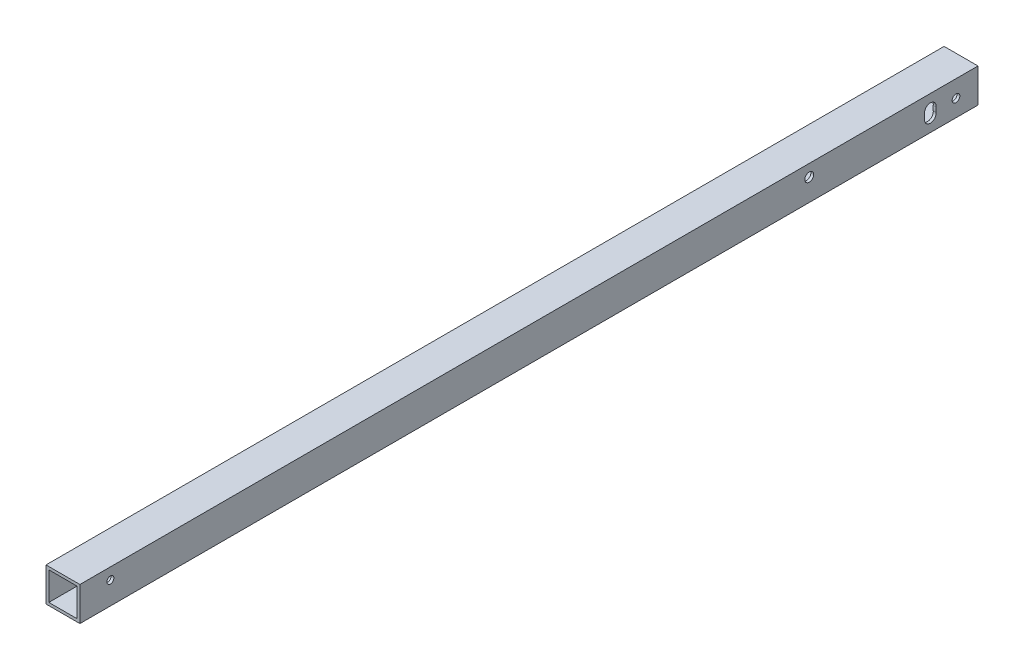
ISO-10303-21;
HEADER;
FILE_DESCRIPTION(('STEP AP214'),'2;1');
FILE_NAME('part.step','',(''),(''),'','','');
FILE_SCHEMA(('AUTOMOTIVE_DESIGN { 1 0 10303 214 1 1 1 1 }'));
ENDSEC;
DATA;
#1=APPLICATION_CONTEXT('core data for automotive mechanical design processes');
#2=APPLICATION_PROTOCOL_DEFINITION('international standard','automotive_design',2000,#1);
#3=PRODUCT_CONTEXT('',#1,'mechanical');
#4=PRODUCT('Part','Part','',(#3));
#5=PRODUCT_RELATED_PRODUCT_CATEGORY('part','',(#4));
#6=PRODUCT_DEFINITION_FORMATION('','',#4);
#7=PRODUCT_DEFINITION_CONTEXT('part definition',#1,'design');
#8=PRODUCT_DEFINITION('design','',#6,#7);
#9=PRODUCT_DEFINITION_SHAPE('','',#8);
#10=(LENGTH_UNIT() NAMED_UNIT(*) SI_UNIT(.MILLI.,.METRE.));
#11=(NAMED_UNIT(*) PLANE_ANGLE_UNIT() SI_UNIT($,.RADIAN.));
#12=(NAMED_UNIT(*) SI_UNIT($,.STERADIAN.) SOLID_ANGLE_UNIT());
#13=UNCERTAINTY_MEASURE_WITH_UNIT(LENGTH_MEASURE(1.E-05),#10,'distance_accuracy_value','');
#14=(GEOMETRIC_REPRESENTATION_CONTEXT(3) GLOBAL_UNCERTAINTY_ASSIGNED_CONTEXT((#13)) GLOBAL_UNIT_ASSIGNED_CONTEXT((#10,
#11,#12)) REPRESENTATION_CONTEXT('',''));
#15=CARTESIAN_POINT('',(0.,0.,0.));
#16=DIRECTION('',(0.,0.,1.));
#17=DIRECTION('',(1.,0.,0.));
#18=AXIS2_PLACEMENT_3D('',#15,#16,#17);
#19=CARTESIAN_POINT('',(-514.70930609531,11.2268,29.9795189389552));
#20=DIRECTION('',(1.,0.,0.));
#21=DIRECTION('',(0.,0.,-1.));
#22=AXIS2_PLACEMENT_3D('',#19,#20,#21);
#23=CYLINDRICAL_SURFACE('',#22,3.2512);
#24=DIRECTION('',(1.,0.,0.));
#25=VECTOR('',#24,1.);
#26=CARTESIAN_POINT('',(-514.70930609531,11.6073682278985,33.2083684653212));
#27=LINE('',#26,#25);
#28=CARTESIAN_POINT('',(7.93750000000004,11.6073682278985,33.2083684653212));
#29=VERTEX_POINT('',#28);
#30=CARTESIAN_POINT('',(9.525,11.6073682278985,33.2083684653212));
#31=VERTEX_POINT('',#30);
#32=EDGE_CURVE('E273',#29,#31,#27,.T.);
#33=ORIENTED_EDGE('',*,*,#32,.F.);
#34=CARTESIAN_POINT('',(7.93750000000004,11.2268,29.9795189389552));
#35=DIRECTION('',(1.,0.,0.));
#36=DIRECTION('',(0.,0.,-1.));
#37=AXIS2_PLACEMENT_3D('',#34,#35,#36);
#38=CIRCLE('',#37,3.2512);
#39=CARTESIAN_POINT('',(7.93750000000004,10.8462317721015,26.7506694125892));
#40=VERTEX_POINT('',#39);
#41=EDGE_CURVE('E218',#29,#40,#38,.F.);
#42=ORIENTED_EDGE('',*,*,#41,.T.);
#43=DIRECTION('',(1.,0.,0.));
#44=VECTOR('',#43,1.);
#45=CARTESIAN_POINT('',(-514.70930609531,10.8462317721015,26.7506694125892));
#46=LINE('',#45,#44);
#47=CARTESIAN_POINT('',(9.52500000000001,10.8462317721015,26.7506694125892));
#48=VERTEX_POINT('',#47);
#49=EDGE_CURVE('E260',#40,#48,#46,.T.);
#50=ORIENTED_EDGE('',*,*,#49,.T.);
#51=CARTESIAN_POINT('',(9.525,11.2268,29.9795189389552));
#52=DIRECTION('',(1.,0.,0.));
#53=DIRECTION('',(0.,0.,-1.));
#54=AXIS2_PLACEMENT_3D('',#51,#52,#53);
#55=CIRCLE('',#54,3.2512);
#56=EDGE_CURVE('E251',#48,#31,#55,.T.);
#57=ORIENTED_EDGE('',*,*,#56,.T.);
#58=EDGE_LOOP('',(#33,#42,#50,#57));
#59=FACE_BOUND('',#58,.T.);
#60=ADVANCED_FACE('F36',(#59),#23,.F.);
#61=CARTESIAN_POINT('',(-514.70930609531,9.525,15.5409617469566));
#62=DIRECTION('',(1.,0.,0.));
#63=DIRECTION('',(0.,0.,-1.));
#64=AXIS2_PLACEMENT_3D('',#61,#62,#63);
#65=CYLINDRICAL_SURFACE('',#64,17.7897025716755);
#66=DIRECTION('',(1.,0.,0.));
#67=VECTOR('',#66,1.);
#68=CARTESIAN_POINT('',(-514.70930609531,7.44263177210153,33.2083684653212));
#69=LINE('',#68,#67);
#70=CARTESIAN_POINT('',(7.93750000000004,7.44263177210153,33.2083684653212));
#71=VERTEX_POINT('',#70);
#72=CARTESIAN_POINT('',(9.525,7.44263177210153,33.2083684653212));
#73=VERTEX_POINT('',#72);
#74=EDGE_CURVE('E269',#71,#73,#69,.T.);
#75=ORIENTED_EDGE('',*,*,#74,.F.);
#76=CARTESIAN_POINT('',(7.93750000000004,9.525,15.5409617469566));
#77=DIRECTION('',(1.,0.,0.));
#78=DIRECTION('',(0.,0.,-1.));
#79=AXIS2_PLACEMENT_3D('',#76,#77,#78);
#80=CIRCLE('',#79,17.7897025716755);
#81=EDGE_CURVE('E215',#71,#29,#80,.F.);
#82=ORIENTED_EDGE('',*,*,#81,.T.);
#83=ORIENTED_EDGE('',*,*,#32,.T.);
#84=CARTESIAN_POINT('',(9.525,9.525,15.5409617469566));
#85=DIRECTION('',(1.,0.,0.));
#86=DIRECTION('',(0.,0.,-1.));
#87=AXIS2_PLACEMENT_3D('',#84,#85,#86);
#88=CIRCLE('',#87,17.7897025716755);
#89=EDGE_CURVE('E254',#31,#73,#88,.T.);
#90=ORIENTED_EDGE('',*,*,#89,.T.);
#91=EDGE_LOOP('',(#75,#82,#83,#90));
#92=FACE_BOUND('',#91,.T.);
#93=ADVANCED_FACE('F318',(#92),#65,.F.);
#94=CARTESIAN_POINT('',(-514.70930609531,7.8232,29.9795189389552));
#95=DIRECTION('',(1.,0.,0.));
#96=DIRECTION('',(0.,0.,-1.));
#97=AXIS2_PLACEMENT_3D('',#94,#95,#96);
#98=CYLINDRICAL_SURFACE('',#97,3.2512);
#99=DIRECTION('',(1.,0.,0.));
#100=VECTOR('',#99,1.);
#101=CARTESIAN_POINT('',(-514.70930609531,8.20376822789848,26.7506694125892));
#102=LINE('',#101,#100);
#103=CARTESIAN_POINT('',(7.93750000000004,8.20376822789848,26.7506694125892));
#104=VERTEX_POINT('',#103);
#105=CARTESIAN_POINT('',(9.525,8.20376822789848,26.7506694125892));
#106=VERTEX_POINT('',#105);
#107=EDGE_CURVE('E265',#104,#106,#102,.T.);
#108=ORIENTED_EDGE('',*,*,#107,.F.);
#109=CARTESIAN_POINT('',(7.93750000000004,7.8232,29.9795189389552));
#110=DIRECTION('',(1.,0.,0.));
#111=DIRECTION('',(0.,0.,-1.));
#112=AXIS2_PLACEMENT_3D('',#109,#110,#111);
#113=CIRCLE('',#112,3.2512);
#114=EDGE_CURVE('E212',#104,#71,#113,.F.);
#115=ORIENTED_EDGE('',*,*,#114,.T.);
#116=ORIENTED_EDGE('',*,*,#74,.T.);
#117=CARTESIAN_POINT('',(9.525,7.8232,29.9795189389552));
#118=DIRECTION('',(1.,0.,0.));
#119=DIRECTION('',(0.,0.,-1.));
#120=AXIS2_PLACEMENT_3D('',#117,#118,#119);
#121=CIRCLE('',#120,3.2512);
#122=EDGE_CURVE('E257',#73,#106,#121,.T.);
#123=ORIENTED_EDGE('',*,*,#122,.T.);
#124=EDGE_LOOP('',(#108,#115,#116,#123));
#125=FACE_BOUND('',#124,.T.);
#126=ADVANCED_FACE('F325',(#125),#98,.F.);
#127=CARTESIAN_POINT('',(-514.70930609531,9.525,15.5409617469566));
#128=DIRECTION('',(1.,0.,0.));
#129=DIRECTION('',(0.,0.,-1.));
#130=AXIS2_PLACEMENT_3D('',#127,#128,#129);
#131=CYLINDRICAL_SURFACE('',#130,11.2873025716755);
#132=ORIENTED_EDGE('',*,*,#49,.F.);
#133=CARTESIAN_POINT('',(7.93750000000004,9.525,15.5409617469566));
#134=DIRECTION('',(1.,0.,0.));
#135=DIRECTION('',(0.,0.,-1.));
#136=AXIS2_PLACEMENT_3D('',#133,#134,#135);
#137=CIRCLE('',#136,11.2873025716755);
#138=EDGE_CURVE('E209',#40,#104,#137,.T.);
#139=ORIENTED_EDGE('',*,*,#138,.T.);
#140=ORIENTED_EDGE('',*,*,#107,.T.);
#141=CARTESIAN_POINT('',(9.525,9.525,15.5409617469566));
#142=DIRECTION('',(-1.,0.,0.));
#143=DIRECTION('',(0.,0.,-1.));
#144=AXIS2_PLACEMENT_3D('',#141,#142,#143);
#145=CIRCLE('',#144,11.2873025716755);
#146=EDGE_CURVE('E233',#106,#48,#145,.T.);
#147=ORIENTED_EDGE('',*,*,#146,.T.);
#148=EDGE_LOOP('',(#132,#139,#140,#147));
#149=FACE_BOUND('',#148,.T.);
#150=ADVANCED_FACE('F363',(#149),#131,.T.);
#151=CARTESIAN_POINT('',(15.24,12.3825,98.0414901922339));
#152=DIRECTION('',(1.,0.,0.));
#153=DIRECTION('',(0.,0.,-1.));
#154=AXIS2_PLACEMENT_3D('',#151,#152,#153);
#155=CYLINDRICAL_SURFACE('',#154,2.4892);
#156=CARTESIAN_POINT('',(7.9375,12.3825,98.0414901922339));
#157=DIRECTION('',(1.,0.,0.));
#158=DIRECTION('',(0.,0.,-1.));
#159=AXIS2_PLACEMENT_3D('',#156,#157,#158);
#160=CIRCLE('',#159,2.4892);
#161=CARTESIAN_POINT('',(7.9375,12.3825,95.5522901922339));
#162=VERTEX_POINT('',#161);
#163=EDGE_CURVE('E206',#162,#162,#160,.F.);
#164=ORIENTED_EDGE('',*,*,#163,.T.);
#165=EDGE_LOOP('',(#164));
#166=FACE_BOUND('',#165,.T.);
#167=CARTESIAN_POINT('',(9.525,12.3825,98.0414901922339));
#168=DIRECTION('',(1.,0.,0.));
#169=DIRECTION('',(0.,0.,-1.));
#170=AXIS2_PLACEMENT_3D('',#167,#168,#169);
#171=CIRCLE('',#170,2.4892);
#172=CARTESIAN_POINT('',(9.525,12.3825,95.5522901922339));
#173=VERTEX_POINT('',#172);
#174=EDGE_CURVE('E230',#173,#173,#171,.T.);
#175=ORIENTED_EDGE('',*,*,#174,.T.);
#176=EDGE_LOOP('',(#175));
#177=FACE_BOUND('',#176,.T.);
#178=ADVANCED_FACE('F362',(#166,#177),#155,.F.);
#179=CARTESIAN_POINT('',(15.24,9.525,15.5409617469566));
#180=DIRECTION('',(1.,0.,0.));
#181=DIRECTION('',(0.,0.,-1.));
#182=AXIS2_PLACEMENT_3D('',#179,#180,#181);
#183=CYLINDRICAL_SURFACE('',#182,2.15264999999999);
#184=CARTESIAN_POINT('',(7.9375,9.525,15.5409617469566));
#185=DIRECTION('',(1.,0.,0.));
#186=DIRECTION('',(0.,0.,-1.));
#187=AXIS2_PLACEMENT_3D('',#184,#185,#186);
#188=CIRCLE('',#187,2.15264999999999);
#189=CARTESIAN_POINT('',(7.9375,9.525,13.3883117469566));
#190=VERTEX_POINT('',#189);
#191=EDGE_CURVE('E40',#190,#190,#188,.F.);
#192=ORIENTED_EDGE('',*,*,#191,.T.);
#193=EDGE_LOOP('',(#192));
#194=FACE_BOUND('',#193,.T.);
#195=CARTESIAN_POINT('',(9.525,9.525,15.5409617469566));
#196=DIRECTION('',(1.,0.,0.));
#197=DIRECTION('',(0.,0.,-1.));
#198=AXIS2_PLACEMENT_3D('',#195,#196,#197);
#199=CIRCLE('',#198,2.15264999999999);
#200=CARTESIAN_POINT('',(9.525,9.525,13.3883117469566));
#201=VERTEX_POINT('',#200);
#202=EDGE_CURVE('E224',#201,#201,#199,.T.);
#203=ORIENTED_EDGE('',*,*,#202,.T.);
#204=EDGE_LOOP('',(#203));
#205=FACE_BOUND('',#204,.T.);
#206=ADVANCED_FACE('F414',(#194,#205),#183,.F.);
#207=CARTESIAN_POINT('',(-514.70930609531,19.0499999999999,508.));
#208=DIRECTION('',(0.,0.,1.));
#209=DIRECTION('',(1.,0.,0.));
#210=AXIS2_PLACEMENT_3D('',#207,#208,#209);
#211=PLANE('',#210);
#212=DIRECTION('',(-1.,0.,0.));
#213=VECTOR('',#212,1.);
#214=CARTESIAN_POINT('',(7.9375,1.58749999999993,508.));
#215=LINE('',#214,#213);
#216=CARTESIAN_POINT('',(7.9375,1.58749999999993,508.));
#217=VERTEX_POINT('',#216);
#218=CARTESIAN_POINT('',(-7.93750000000001,1.58749999999993,508.));
#219=VERTEX_POINT('',#218);
#220=EDGE_CURVE('E152',#217,#219,#215,.T.);
#221=ORIENTED_EDGE('',*,*,#220,.T.);
#222=DIRECTION('',(0.,1.,0.));
#223=VECTOR('',#222,1.);
#224=CARTESIAN_POINT('',(-7.93750000000001,1.58749999999993,508.));
#225=LINE('',#224,#223);
#226=CARTESIAN_POINT('',(-7.93750000000004,17.4625,508.));
#227=VERTEX_POINT('',#226);
#228=EDGE_CURVE('E161',#219,#227,#225,.T.);
#229=ORIENTED_EDGE('',*,*,#228,.T.);
#230=DIRECTION('',(1.,0.,0.));
#231=VECTOR('',#230,1.);
#232=CARTESIAN_POINT('',(-7.93750000000001,17.4624999999999,508.));
#233=LINE('',#232,#231);
#234=CARTESIAN_POINT('',(7.9375,17.4624999999999,508.));
#235=VERTEX_POINT('',#234);
#236=EDGE_CURVE('E53',#227,#235,#233,.T.);
#237=ORIENTED_EDGE('',*,*,#236,.T.);
#238=DIRECTION('',(0.,-1.,0.));
#239=VECTOR('',#238,1.);
#240=CARTESIAN_POINT('',(7.9375,17.4624999999999,508.));
#241=LINE('',#240,#239);
#242=EDGE_CURVE('E158',#235,#217,#241,.T.);
#243=ORIENTED_EDGE('',*,*,#242,.T.);
#244=EDGE_LOOP('',(#221,#229,#237,#243));
#245=FACE_BOUND('',#244,.T.);
#246=DIRECTION('',(0.,1.,0.));
#247=VECTOR('',#246,1.);
#248=CARTESIAN_POINT('',(-9.52500000000001,19.0499999999999,508.));
#249=LINE('',#248,#247);
#250=CARTESIAN_POINT('',(-9.52500000000001,0.,508.));
#251=VERTEX_POINT('',#250);
#252=CARTESIAN_POINT('',(-9.52500000000001,19.0499999999999,508.));
#253=VERTEX_POINT('',#252);
#254=EDGE_CURVE('E11',#251,#253,#249,.T.);
#255=ORIENTED_EDGE('',*,*,#254,.F.);
#256=DIRECTION('',(1.,0.,0.));
#257=VECTOR('',#256,1.);
#258=CARTESIAN_POINT('',(-514.70930609531,0.,508.));
#259=LINE('',#258,#257);
#260=CARTESIAN_POINT('',(9.525,0.,508.));
#261=VERTEX_POINT('',#260);
#262=EDGE_CURVE('E293',#251,#261,#259,.T.);
#263=ORIENTED_EDGE('',*,*,#262,.T.);
#264=DIRECTION('',(0.,-1.,0.));
#265=VECTOR('',#264,1.);
#266=CARTESIAN_POINT('',(9.525,19.0499999999999,508.));
#267=LINE('',#266,#265);
#268=CARTESIAN_POINT('',(9.525,19.0499999999999,508.));
#269=VERTEX_POINT('',#268);
#270=EDGE_CURVE('E279',#269,#261,#267,.T.);
#271=ORIENTED_EDGE('',*,*,#270,.F.);
#272=DIRECTION('',(1.,0.,0.));
#273=VECTOR('',#272,1.);
#274=CARTESIAN_POINT('',(-514.70930609531,19.0499999999999,508.));
#275=LINE('',#274,#273);
#276=EDGE_CURVE('E288',#253,#269,#275,.T.);
#277=ORIENTED_EDGE('',*,*,#276,.F.);
#278=EDGE_LOOP('',(#255,#263,#271,#277));
#279=FACE_BOUND('',#278,.T.);
#280=ADVANCED_FACE('F166',(#245,#279),#211,.T.);
#281=CARTESIAN_POINT('',(-514.70930609531,0.,3.175));
#282=DIRECTION('',(0.,-1.,0.));
#283=DIRECTION('',(0.,0.,-1.));
#284=AXIS2_PLACEMENT_3D('',#281,#282,#283);
#285=PLANE('',#284);
#286=DIRECTION('',(0.,0.,1.));
#287=VECTOR('',#286,1.);
#288=CARTESIAN_POINT('',(-9.52500000000001,0.,3.175));
#289=LINE('',#288,#287);
#290=CARTESIAN_POINT('',(-9.52500000000001,0.,3.175));
#291=VERTEX_POINT('',#290);
#292=EDGE_CURVE('E243',#291,#251,#289,.T.);
#293=ORIENTED_EDGE('',*,*,#292,.F.);
#294=DIRECTION('',(1.,0.,0.));
#295=VECTOR('',#294,1.);
#296=CARTESIAN_POINT('',(-514.70930609531,0.,3.175));
#297=LINE('',#296,#295);
#298=CARTESIAN_POINT('',(9.525,0.,3.175));
#299=VERTEX_POINT('',#298);
#300=EDGE_CURVE('E291',#291,#299,#297,.T.);
#301=ORIENTED_EDGE('',*,*,#300,.T.);
#302=DIRECTION('',(0.,0.,-1.));
#303=VECTOR('',#302,1.);
#304=CARTESIAN_POINT('',(9.525,0.,3.175));
#305=LINE('',#304,#303);
#306=EDGE_CURVE('E282',#261,#299,#305,.T.);
#307=ORIENTED_EDGE('',*,*,#306,.F.);
#308=ORIENTED_EDGE('',*,*,#262,.F.);
#309=EDGE_LOOP('',(#293,#301,#307,#308));
#310=FACE_BOUND('',#309,.T.);
#311=ADVANCED_FACE('F399',(#310),#285,.T.);
#312=CARTESIAN_POINT('',(-514.70930609531,19.05,3.175));
#313=DIRECTION('',(0.,0.,-1.));
#314=DIRECTION('',(0.,1.,0.));
#315=AXIS2_PLACEMENT_3D('',#312,#313,#314);
#316=PLANE('',#315);
#317=DIRECTION('',(-1.,0.,0.));
#318=VECTOR('',#317,1.);
#319=CARTESIAN_POINT('',(7.9375,1.5875,3.175));
#320=LINE('',#319,#318);
#321=CARTESIAN_POINT('',(7.9375,1.5875,3.175));
#322=VERTEX_POINT('',#321);
#323=CARTESIAN_POINT('',(-7.93750000000004,1.58749999999993,3.175));
#324=VERTEX_POINT('',#323);
#325=EDGE_CURVE('E61',#322,#324,#320,.T.);
#326=ORIENTED_EDGE('',*,*,#325,.F.);
#327=DIRECTION('',(0.,-1.,0.));
#328=VECTOR('',#327,1.);
#329=CARTESIAN_POINT('',(7.9375,17.4625,3.175));
#330=LINE('',#329,#328);
#331=CARTESIAN_POINT('',(7.9375,17.4625,3.175));
#332=VERTEX_POINT('',#331);
#333=EDGE_CURVE('E169',#332,#322,#330,.T.);
#334=ORIENTED_EDGE('',*,*,#333,.F.);
#335=DIRECTION('',(1.,0.,0.));
#336=VECTOR('',#335,1.);
#337=CARTESIAN_POINT('',(-7.93750000000001,17.4625,3.175));
#338=LINE('',#337,#336);
#339=CARTESIAN_POINT('',(-7.93750000000001,17.4625,3.175));
#340=VERTEX_POINT('',#339);
#341=EDGE_CURVE('E172',#340,#332,#338,.T.);
#342=ORIENTED_EDGE('',*,*,#341,.F.);
#343=DIRECTION('',(0.,1.,0.));
#344=VECTOR('',#343,1.);
#345=CARTESIAN_POINT('',(-7.93750000000001,1.5875,3.175));
#346=LINE('',#345,#344);
#347=EDGE_CURVE('E181',#324,#340,#346,.T.);
#348=ORIENTED_EDGE('',*,*,#347,.F.);
#349=EDGE_LOOP('',(#326,#334,#342,#348));
#350=FACE_BOUND('',#349,.T.);
#351=DIRECTION('',(0.,-1.,0.));
#352=VECTOR('',#351,1.);
#353=CARTESIAN_POINT('',(-9.52500000000001,19.05,3.175));
#354=LINE('',#353,#352);
#355=CARTESIAN_POINT('',(-9.52500000000001,19.05,3.175));
#356=VERTEX_POINT('',#355);
#357=EDGE_CURVE('E245',#356,#291,#354,.T.);
#358=ORIENTED_EDGE('',*,*,#357,.F.);
#359=DIRECTION('',(1.,0.,0.));
#360=VECTOR('',#359,1.);
#361=CARTESIAN_POINT('',(-514.70930609531,19.05,3.175));
#362=LINE('',#361,#360);
#363=CARTESIAN_POINT('',(9.525,19.05,3.175));
#364=VERTEX_POINT('',#363);
#365=EDGE_CURVE('E289',#356,#364,#362,.T.);
#366=ORIENTED_EDGE('',*,*,#365,.T.);
#367=DIRECTION('',(0.,1.,0.));
#368=VECTOR('',#367,1.);
#369=CARTESIAN_POINT('',(9.525,19.05,3.175));
#370=LINE('',#369,#368);
#371=EDGE_CURVE('E285',#299,#364,#370,.T.);
#372=ORIENTED_EDGE('',*,*,#371,.F.);
#373=ORIENTED_EDGE('',*,*,#300,.F.);
#374=EDGE_LOOP('',(#358,#366,#372,#373));
#375=FACE_BOUND('',#374,.T.);
#376=ADVANCED_FACE('F403',(#350,#375),#316,.T.);
#377=CARTESIAN_POINT('',(-514.70930609531,19.05,3.175));
#378=DIRECTION('',(0.,1.,0.));
#379=DIRECTION('',(0.,0.,1.));
#380=AXIS2_PLACEMENT_3D('',#377,#378,#379);
#381=PLANE('',#380);
#382=DIRECTION('',(0.,0.,-1.));
#383=VECTOR('',#382,1.);
#384=CARTESIAN_POINT('',(-9.52500000000001,19.05,3.175));
#385=LINE('',#384,#383);
#386=EDGE_CURVE('E241',#253,#356,#385,.T.);
#387=ORIENTED_EDGE('',*,*,#386,.F.);
#388=ORIENTED_EDGE('',*,*,#276,.T.);
#389=DIRECTION('',(0.,0.,1.));
#390=VECTOR('',#389,1.);
#391=CARTESIAN_POINT('',(9.525,19.05,3.175));
#392=LINE('',#391,#390);
#393=EDGE_CURVE('E264',#364,#269,#392,.T.);
#394=ORIENTED_EDGE('',*,*,#393,.F.);
#395=ORIENTED_EDGE('',*,*,#365,.F.);
#396=EDGE_LOOP('',(#387,#388,#394,#395));
#397=FACE_BOUND('',#396,.T.);
#398=ADVANCED_FACE('F38',(#397),#381,.T.);
#399=CARTESIAN_POINT('',(9.525,0.,0.));
#400=DIRECTION('',(1.,0.,0.));
#401=DIRECTION('',(0.,0.,-1.));
#402=AXIS2_PLACEMENT_3D('',#399,#400,#401);
#403=PLANE('',#402);
#404=CARTESIAN_POINT('',(9.525,12.6999999999999,490.855));
#405=DIRECTION('',(1.,0.,0.));
#406=DIRECTION('',(0.,0.,-1.));
#407=AXIS2_PLACEMENT_3D('',#404,#405,#406);
#408=CIRCLE('',#407,1.9812);
#409=CARTESIAN_POINT('',(9.525,12.6999999999999,488.8738));
#410=VERTEX_POINT('',#409);
#411=EDGE_CURVE('E498',#410,#410,#408,.T.);
#412=ORIENTED_EDGE('',*,*,#411,.F.);
#413=EDGE_LOOP('',(#412));
#414=FACE_BOUND('',#413,.T.);
#415=ORIENTED_EDGE('',*,*,#202,.F.);
#416=EDGE_LOOP('',(#415));
#417=FACE_BOUND('',#416,.T.);
#418=ORIENTED_EDGE('',*,*,#174,.F.);
#419=EDGE_LOOP('',(#418));
#420=FACE_BOUND('',#419,.T.);
#421=ORIENTED_EDGE('',*,*,#146,.F.);
#422=ORIENTED_EDGE('',*,*,#122,.F.);
#423=ORIENTED_EDGE('',*,*,#89,.F.);
#424=ORIENTED_EDGE('',*,*,#56,.F.);
#425=EDGE_LOOP('',(#421,#422,#423,#424));
#426=FACE_BOUND('',#425,.T.);
#427=ORIENTED_EDGE('',*,*,#393,.T.);
#428=ORIENTED_EDGE('',*,*,#270,.T.);
#429=ORIENTED_EDGE('',*,*,#306,.T.);
#430=ORIENTED_EDGE('',*,*,#371,.T.);
#431=EDGE_LOOP('',(#427,#428,#429,#430));
#432=FACE_BOUND('',#431,.T.);
#433=ADVANCED_FACE('F332',(#414,#417,#420,#426,#432),#403,.T.);
#434=CARTESIAN_POINT('',(-9.52500000000001,10.8462317721015,26.7506694125892));
#435=VERTEX_POINT('',#434);
#436=CARTESIAN_POINT('',(-7.93750000000004,10.8462317721015,26.7506694125892));
#437=VERTEX_POINT('',#436);
#438=EDGE_CURVE('E274',#435,#437,#46,.T.);
#439=ORIENTED_EDGE('',*,*,#438,.T.);
#440=CARTESIAN_POINT('',(-7.93750000000004,11.2268,29.9795189389552));
#441=DIRECTION('',(-1.,0.,0.));
#442=DIRECTION('',(0.,0.,1.));
#443=AXIS2_PLACEMENT_3D('',#440,#441,#442);
#444=CIRCLE('',#443,3.2512);
#445=CARTESIAN_POINT('',(-7.93750000000004,11.6073682278985,33.2083684653212));
#446=VERTEX_POINT('',#445);
#447=EDGE_CURVE('E203',#437,#446,#444,.F.);
#448=ORIENTED_EDGE('',*,*,#447,.T.);
#449=CARTESIAN_POINT('',(-9.52500000000001,11.6073682278985,33.2083684653212));
#450=VERTEX_POINT('',#449);
#451=EDGE_CURVE('E270',#450,#446,#27,.T.);
#452=ORIENTED_EDGE('',*,*,#451,.F.);
#453=CARTESIAN_POINT('',(-9.52500000000001,11.2268,29.9795189389552));
#454=DIRECTION('',(1.,0.,0.));
#455=DIRECTION('',(0.,0.,-1.));
#456=AXIS2_PLACEMENT_3D('',#453,#454,#455);
#457=CIRCLE('',#456,3.2512);
#458=EDGE_CURVE('E246',#450,#435,#457,.F.);
#459=ORIENTED_EDGE('',*,*,#458,.T.);
#460=EDGE_LOOP('',(#439,#448,#452,#459));
#461=FACE_BOUND('',#460,.T.);
#462=ADVANCED_FACE('F321',(#461),#23,.F.);
#463=ORIENTED_EDGE('',*,*,#451,.T.);
#464=CARTESIAN_POINT('',(-7.93750000000004,9.525,15.5409617469566));
#465=DIRECTION('',(-1.,0.,0.));
#466=DIRECTION('',(0.,0.,1.));
#467=AXIS2_PLACEMENT_3D('',#464,#465,#466);
#468=CIRCLE('',#467,17.7897025716755);
#469=CARTESIAN_POINT('',(-7.93750000000004,7.44263177210153,33.2083684653212));
#470=VERTEX_POINT('',#469);
#471=EDGE_CURVE('E200',#446,#470,#468,.F.);
#472=ORIENTED_EDGE('',*,*,#471,.T.);
#473=CARTESIAN_POINT('',(-9.52500000000001,7.44263177210153,33.2083684653212));
#474=VERTEX_POINT('',#473);
#475=EDGE_CURVE('E266',#474,#470,#69,.T.);
#476=ORIENTED_EDGE('',*,*,#475,.F.);
#477=CARTESIAN_POINT('',(-9.52500000000001,9.525,15.5409617469566));
#478=DIRECTION('',(1.,0.,0.));
#479=DIRECTION('',(0.,0.,-1.));
#480=AXIS2_PLACEMENT_3D('',#477,#478,#479);
#481=CIRCLE('',#480,17.7897025716755);
#482=EDGE_CURVE('E45',#474,#450,#481,.F.);
#483=ORIENTED_EDGE('',*,*,#482,.T.);
#484=EDGE_LOOP('',(#463,#472,#476,#483));
#485=FACE_BOUND('',#484,.T.);
#486=ADVANCED_FACE('F328',(#485),#65,.F.);
#487=ORIENTED_EDGE('',*,*,#475,.T.);
#488=CARTESIAN_POINT('',(-7.93750000000004,7.8232,29.9795189389552));
#489=DIRECTION('',(-1.,0.,0.));
#490=DIRECTION('',(0.,0.,1.));
#491=AXIS2_PLACEMENT_3D('',#488,#489,#490);
#492=CIRCLE('',#491,3.2512);
#493=CARTESIAN_POINT('',(-7.93750000000004,8.20376822789848,26.7506694125892));
#494=VERTEX_POINT('',#493);
#495=EDGE_CURVE('E197',#470,#494,#492,.F.);
#496=ORIENTED_EDGE('',*,*,#495,.T.);
#497=CARTESIAN_POINT('',(-9.52500000000001,8.20376822789848,26.7506694125892));
#498=VERTEX_POINT('',#497);
#499=EDGE_CURVE('E261',#498,#494,#102,.T.);
#500=ORIENTED_EDGE('',*,*,#499,.F.);
#501=CARTESIAN_POINT('',(-9.52500000000001,7.8232,29.9795189389552));
#502=DIRECTION('',(1.,0.,0.));
#503=DIRECTION('',(0.,0.,-1.));
#504=AXIS2_PLACEMENT_3D('',#501,#502,#503);
#505=CIRCLE('',#504,3.2512);
#506=EDGE_CURVE('E236',#498,#474,#505,.F.);
#507=ORIENTED_EDGE('',*,*,#506,.T.);
#508=EDGE_LOOP('',(#487,#496,#500,#507));
#509=FACE_BOUND('',#508,.T.);
#510=ADVANCED_FACE('F338',(#509),#98,.F.);
#511=ORIENTED_EDGE('',*,*,#499,.T.);
#512=CARTESIAN_POINT('',(-7.93750000000004,9.525,15.5409617469566));
#513=DIRECTION('',(-1.,0.,0.));
#514=DIRECTION('',(0.,0.,1.));
#515=AXIS2_PLACEMENT_3D('',#512,#513,#514);
#516=CIRCLE('',#515,11.2873025716755);
#517=EDGE_CURVE('E194',#494,#437,#516,.T.);
#518=ORIENTED_EDGE('',*,*,#517,.T.);
#519=ORIENTED_EDGE('',*,*,#438,.F.);
#520=CARTESIAN_POINT('',(-9.52500000000001,9.525,15.5409617469566));
#521=DIRECTION('',(1.,0.,0.));
#522=DIRECTION('',(0.,0.,-1.));
#523=AXIS2_PLACEMENT_3D('',#520,#521,#522);
#524=CIRCLE('',#523,11.2873025716755);
#525=EDGE_CURVE('E239',#435,#498,#524,.T.);
#526=ORIENTED_EDGE('',*,*,#525,.T.);
#527=EDGE_LOOP('',(#511,#518,#519,#526));
#528=FACE_BOUND('',#527,.T.);
#529=ADVANCED_FACE('F345',(#528),#131,.T.);
#530=CARTESIAN_POINT('',(-9.525,9.12002090954667,-9.8425));
#531=DIRECTION('',(1.,0.,0.));
#532=DIRECTION('',(0.,0.,-1.));
#533=AXIS2_PLACEMENT_3D('',#530,#531,#532);
#534=PLANE('',#533);
#535=CARTESIAN_POINT('',(-9.525,12.6999999999999,490.855));
#536=DIRECTION('',(-1.,0.,0.));
#537=DIRECTION('',(0.,0.,1.));
#538=AXIS2_PLACEMENT_3D('',#535,#536,#537);
#539=CIRCLE('',#538,3.937);
#540=CARTESIAN_POINT('',(-9.525,12.6999999999999,494.792));
#541=VERTEX_POINT('',#540);
#542=EDGE_CURVE('E495',#541,#541,#539,.T.);
#543=ORIENTED_EDGE('',*,*,#542,.F.);
#544=EDGE_LOOP('',(#543));
#545=FACE_BOUND('',#544,.T.);
#546=CARTESIAN_POINT('',(-9.52500000000001,9.525,15.5409617469566));
#547=DIRECTION('',(1.,0.,0.));
#548=DIRECTION('',(0.,0.,-1.));
#549=AXIS2_PLACEMENT_3D('',#546,#547,#548);
#550=CIRCLE('',#549,2.15264999999999);
#551=CARTESIAN_POINT('',(-9.52500000000001,9.525,13.3883117469566));
#552=VERTEX_POINT('',#551);
#553=EDGE_CURVE('E221',#552,#552,#550,.T.);
#554=ORIENTED_EDGE('',*,*,#553,.T.);
#555=EDGE_LOOP('',(#554));
#556=FACE_BOUND('',#555,.T.);
#557=CARTESIAN_POINT('',(-9.52500000000001,12.3825,98.0414901922339));
#558=DIRECTION('',(1.,0.,0.));
#559=DIRECTION('',(0.,0.,-1.));
#560=AXIS2_PLACEMENT_3D('',#557,#558,#559);
#561=CIRCLE('',#560,2.4892);
#562=CARTESIAN_POINT('',(-9.52500000000001,12.3825,95.5522901922339));
#563=VERTEX_POINT('',#562);
#564=EDGE_CURVE('E227',#563,#563,#561,.T.);
#565=ORIENTED_EDGE('',*,*,#564,.T.);
#566=EDGE_LOOP('',(#565));
#567=FACE_BOUND('',#566,.T.);
#568=ORIENTED_EDGE('',*,*,#386,.T.);
#569=ORIENTED_EDGE('',*,*,#357,.T.);
#570=ORIENTED_EDGE('',*,*,#292,.T.);
#571=ORIENTED_EDGE('',*,*,#254,.T.);
#572=EDGE_LOOP('',(#568,#569,#570,#571));
#573=FACE_BOUND('',#572,.T.);
#574=ORIENTED_EDGE('',*,*,#458,.F.);
#575=ORIENTED_EDGE('',*,*,#482,.F.);
#576=ORIENTED_EDGE('',*,*,#506,.F.);
#577=ORIENTED_EDGE('',*,*,#525,.F.);
#578=EDGE_LOOP('',(#574,#575,#576,#577));
#579=FACE_BOUND('',#578,.T.);
#580=ADVANCED_FACE('F351',(#545,#556,#567,#573,#579),#534,.F.);
#581=CARTESIAN_POINT('',(-7.9375,12.3825,98.0414901922339));
#582=DIRECTION('',(-1.,0.,0.));
#583=DIRECTION('',(0.,0.,1.));
#584=AXIS2_PLACEMENT_3D('',#581,#582,#583);
#585=CIRCLE('',#584,2.4892);
#586=CARTESIAN_POINT('',(-7.9375,12.3825,100.530690192234));
#587=VERTEX_POINT('',#586);
#588=EDGE_CURVE('E191',#587,#587,#585,.F.);
#589=ORIENTED_EDGE('',*,*,#588,.T.);
#590=EDGE_LOOP('',(#589));
#591=FACE_BOUND('',#590,.T.);
#592=ORIENTED_EDGE('',*,*,#564,.F.);
#593=EDGE_LOOP('',(#592));
#594=FACE_BOUND('',#593,.T.);
#595=ADVANCED_FACE('F353',(#591,#594),#155,.F.);
#596=CARTESIAN_POINT('',(-7.9375,9.525,15.5409617469566));
#597=DIRECTION('',(-1.,0.,0.));
#598=DIRECTION('',(0.,0.,1.));
#599=AXIS2_PLACEMENT_3D('',#596,#597,#598);
#600=CIRCLE('',#599,2.15264999999999);
#601=CARTESIAN_POINT('',(-7.9375,9.525,17.6936117469566));
#602=VERTEX_POINT('',#601);
#603=EDGE_CURVE('E187',#602,#602,#600,.F.);
#604=ORIENTED_EDGE('',*,*,#603,.T.);
#605=EDGE_LOOP('',(#604));
#606=FACE_BOUND('',#605,.T.);
#607=ORIENTED_EDGE('',*,*,#553,.F.);
#608=EDGE_LOOP('',(#607));
#609=FACE_BOUND('',#608,.T.);
#610=ADVANCED_FACE('F300',(#606,#609),#183,.F.);
#611=CARTESIAN_POINT('',(7.9375,17.4624999999999,508.));
#612=DIRECTION('',(1.,0.,0.));
#613=DIRECTION('',(0.,0.,-1.));
#614=AXIS2_PLACEMENT_3D('',#611,#612,#613);
#615=PLANE('',#614);
#616=CARTESIAN_POINT('',(7.9375,12.6999999999999,490.855));
#617=DIRECTION('',(1.,0.,0.));
#618=DIRECTION('',(0.,0.,-1.));
#619=AXIS2_PLACEMENT_3D('',#616,#617,#618);
#620=CIRCLE('',#619,1.9812);
#621=CARTESIAN_POINT('',(7.9375,12.6999999999999,488.8738));
#622=VERTEX_POINT('',#621);
#623=EDGE_CURVE('E175',#622,#622,#620,.F.);
#624=ORIENTED_EDGE('',*,*,#623,.F.);
#625=EDGE_LOOP('',(#624));
#626=FACE_BOUND('',#625,.T.);
#627=ORIENTED_EDGE('',*,*,#191,.F.);
#628=EDGE_LOOP('',(#627));
#629=FACE_BOUND('',#628,.T.);
#630=ORIENTED_EDGE('',*,*,#333,.T.);
#631=DIRECTION('',(0.,0.,-1.));
#632=VECTOR('',#631,1.);
#633=CARTESIAN_POINT('',(7.9375,1.58749999999993,508.));
#634=LINE('',#633,#632);
#635=EDGE_CURVE('E185',#217,#322,#634,.T.);
#636=ORIENTED_EDGE('',*,*,#635,.F.);
#637=ORIENTED_EDGE('',*,*,#242,.F.);
#638=DIRECTION('',(0.,0.,-1.));
#639=VECTOR('',#638,1.);
#640=CARTESIAN_POINT('',(7.9375,17.4624999999999,508.));
#641=LINE('',#640,#639);
#642=EDGE_CURVE('E188',#235,#332,#641,.T.);
#643=ORIENTED_EDGE('',*,*,#642,.T.);
#644=EDGE_LOOP('',(#630,#636,#637,#643));
#645=FACE_BOUND('',#644,.T.);
#646=ORIENTED_EDGE('',*,*,#163,.F.);
#647=EDGE_LOOP('',(#646));
#648=FACE_BOUND('',#647,.T.);
#649=ORIENTED_EDGE('',*,*,#81,.F.);
#650=ORIENTED_EDGE('',*,*,#114,.F.);
#651=ORIENTED_EDGE('',*,*,#138,.F.);
#652=ORIENTED_EDGE('',*,*,#41,.F.);
#653=EDGE_LOOP('',(#649,#650,#651,#652));
#654=FACE_BOUND('',#653,.T.);
#655=ADVANCED_FACE('F304',(#626,#629,#645,#648,#654),#615,.F.);
#656=CARTESIAN_POINT('',(-7.93750000000001,1.58749999999993,508.));
#657=DIRECTION('',(-1.,0.,0.));
#658=DIRECTION('',(0.,0.,1.));
#659=AXIS2_PLACEMENT_3D('',#656,#657,#658);
#660=PLANE('',#659);
#661=CARTESIAN_POINT('',(-7.93750000000001,12.6999999999999,490.855));
#662=DIRECTION('',(-1.,0.,0.));
#663=DIRECTION('',(0.,0.,1.));
#664=AXIS2_PLACEMENT_3D('',#661,#662,#663);
#665=CIRCLE('',#664,3.937);
#666=CARTESIAN_POINT('',(-7.93750000000001,12.6999999999999,494.792));
#667=VERTEX_POINT('',#666);
#668=EDGE_CURVE('E497',#667,#667,#665,.F.);
#669=ORIENTED_EDGE('',*,*,#668,.F.);
#670=EDGE_LOOP('',(#669));
#671=FACE_BOUND('',#670,.T.);
#672=ORIENTED_EDGE('',*,*,#603,.F.);
#673=EDGE_LOOP('',(#672));
#674=FACE_BOUND('',#673,.T.);
#675=ORIENTED_EDGE('',*,*,#347,.T.);
#676=DIRECTION('',(0.,0.,-1.));
#677=VECTOR('',#676,1.);
#678=CARTESIAN_POINT('',(-7.93750000000001,17.4624999999999,508.));
#679=LINE('',#678,#677);
#680=EDGE_CURVE('E157',#227,#340,#679,.T.);
#681=ORIENTED_EDGE('',*,*,#680,.F.);
#682=ORIENTED_EDGE('',*,*,#228,.F.);
#683=DIRECTION('',(0.,0.,-1.));
#684=VECTOR('',#683,1.);
#685=CARTESIAN_POINT('',(-7.93750000000001,1.58749999999993,508.));
#686=LINE('',#685,#684);
#687=EDGE_CURVE('E148',#219,#324,#686,.T.);
#688=ORIENTED_EDGE('',*,*,#687,.T.);
#689=EDGE_LOOP('',(#675,#681,#682,#688));
#690=FACE_BOUND('',#689,.T.);
#691=ORIENTED_EDGE('',*,*,#588,.F.);
#692=EDGE_LOOP('',(#691));
#693=FACE_BOUND('',#692,.T.);
#694=ORIENTED_EDGE('',*,*,#517,.F.);
#695=ORIENTED_EDGE('',*,*,#495,.F.);
#696=ORIENTED_EDGE('',*,*,#471,.F.);
#697=ORIENTED_EDGE('',*,*,#447,.F.);
#698=EDGE_LOOP('',(#694,#695,#696,#697));
#699=FACE_BOUND('',#698,.T.);
#700=ADVANCED_FACE('F162',(#671,#674,#690,#693,#699),#660,.F.);
#701=CARTESIAN_POINT('',(7.9375,1.58749999999993,508.));
#702=DIRECTION('',(0.,-1.,0.));
#703=DIRECTION('',(0.,0.,-1.));
#704=AXIS2_PLACEMENT_3D('',#701,#702,#703);
#705=PLANE('',#704);
#706=ORIENTED_EDGE('',*,*,#325,.T.);
#707=ORIENTED_EDGE('',*,*,#687,.F.);
#708=ORIENTED_EDGE('',*,*,#220,.F.);
#709=ORIENTED_EDGE('',*,*,#635,.T.);
#710=EDGE_LOOP('',(#706,#707,#708,#709));
#711=FACE_BOUND('',#710,.T.);
#712=ADVANCED_FACE('F150',(#711),#705,.F.);
#713=CARTESIAN_POINT('',(-7.93750000000001,17.4624999999999,508.));
#714=DIRECTION('',(0.,1.,0.));
#715=DIRECTION('',(0.,0.,1.));
#716=AXIS2_PLACEMENT_3D('',#713,#714,#715);
#717=PLANE('',#716);
#718=ORIENTED_EDGE('',*,*,#341,.T.);
#719=ORIENTED_EDGE('',*,*,#642,.F.);
#720=ORIENTED_EDGE('',*,*,#236,.F.);
#721=ORIENTED_EDGE('',*,*,#680,.T.);
#722=EDGE_LOOP('',(#718,#719,#720,#721));
#723=FACE_BOUND('',#722,.T.);
#724=ADVANCED_FACE('F311',(#723),#717,.F.);
#725=CARTESIAN_POINT('',(-9.52600000000001,12.6999999999999,490.855));
#726=DIRECTION('',(1.,0.,0.));
#727=DIRECTION('',(0.,0.,-1.));
#728=AXIS2_PLACEMENT_3D('',#725,#726,#727);
#729=CYLINDRICAL_SURFACE('',#728,1.9812);
#730=ORIENTED_EDGE('',*,*,#411,.T.);
#731=EDGE_LOOP('',(#730));
#732=FACE_BOUND('',#731,.T.);
#733=ORIENTED_EDGE('',*,*,#623,.T.);
#734=EDGE_LOOP('',(#733));
#735=FACE_BOUND('',#734,.T.);
#736=ADVANCED_FACE('F446',(#732,#735),#729,.F.);
#737=CARTESIAN_POINT('',(9.526,12.6999999999999,490.855));
#738=DIRECTION('',(-1.,0.,0.));
#739=DIRECTION('',(0.,0.,1.));
#740=AXIS2_PLACEMENT_3D('',#737,#738,#739);
#741=CYLINDRICAL_SURFACE('',#740,3.937);
#742=ORIENTED_EDGE('',*,*,#542,.T.);
#743=EDGE_LOOP('',(#742));
#744=FACE_BOUND('',#743,.T.);
#745=ORIENTED_EDGE('',*,*,#668,.T.);
#746=EDGE_LOOP('',(#745));
#747=FACE_BOUND('',#746,.T.);
#748=ADVANCED_FACE('F450',(#744,#747),#741,.F.);
#749=CLOSED_SHELL('',(#60,#93,#126,#150,#178,#206,#280,#311,#376,#398,#433,#462,#486,#510,#529,
#580,#595,#610,#655,#700,#712,#724,#736,#748));
#750=MANIFOLD_SOLID_BREP('B2',#749);
#751=ADVANCED_BREP_SHAPE_REPRESENTATION('',(#18,#750),#14);
#752=SHAPE_DEFINITION_REPRESENTATION(#9,#751);
ENDSEC;
END-ISO-10303-21;
